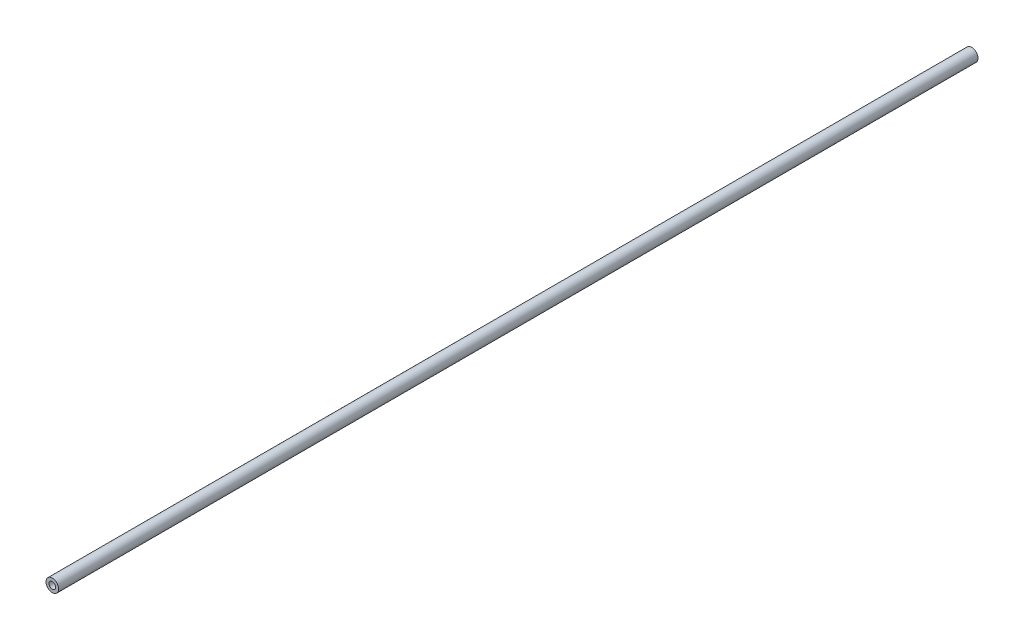
ISO-10303-21;
HEADER;
FILE_DESCRIPTION(('STEP AP214'),'2;1');
FILE_NAME('part.step','',(''),(''),'','','');
FILE_SCHEMA(('AUTOMOTIVE_DESIGN { 1 0 10303 214 1 1 1 1 }'));
ENDSEC;
DATA;
#1=APPLICATION_CONTEXT('core data for automotive mechanical design processes');
#2=APPLICATION_PROTOCOL_DEFINITION('international standard','automotive_design',2000,#1);
#3=PRODUCT_CONTEXT('',#1,'mechanical');
#4=PRODUCT('Part','Part','',(#3));
#5=PRODUCT_RELATED_PRODUCT_CATEGORY('part','',(#4));
#6=PRODUCT_DEFINITION_FORMATION('','',#4);
#7=PRODUCT_DEFINITION_CONTEXT('part definition',#1,'design');
#8=PRODUCT_DEFINITION('design','',#6,#7);
#9=PRODUCT_DEFINITION_SHAPE('','',#8);
#10=(LENGTH_UNIT() NAMED_UNIT(*) SI_UNIT(.MILLI.,.METRE.));
#11=(NAMED_UNIT(*) PLANE_ANGLE_UNIT() SI_UNIT($,.RADIAN.));
#12=(NAMED_UNIT(*) SI_UNIT($,.STERADIAN.) SOLID_ANGLE_UNIT());
#13=UNCERTAINTY_MEASURE_WITH_UNIT(LENGTH_MEASURE(1.E-05),#10,'distance_accuracy_value','');
#14=(GEOMETRIC_REPRESENTATION_CONTEXT(3) GLOBAL_UNCERTAINTY_ASSIGNED_CONTEXT((#13)) GLOBAL_UNIT_ASSIGNED_CONTEXT((#10,
#11,#12)) REPRESENTATION_CONTEXT('',''));
#15=CARTESIAN_POINT('',(0.,0.,0.));
#16=DIRECTION('',(0.,0.,1.));
#17=DIRECTION('',(1.,0.,0.));
#18=AXIS2_PLACEMENT_3D('',#15,#16,#17);
#19=CARTESIAN_POINT('',(0.,0.,692.15));
#20=DIRECTION('',(0.,0.,1.));
#21=DIRECTION('',(1.,0.,0.));
#22=AXIS2_PLACEMENT_3D('',#19,#20,#21);
#23=PLANE('',#22);
#24=CARTESIAN_POINT('',(0.,0.,692.15));
#25=DIRECTION('',(0.,0.,1.));
#26=DIRECTION('',(1.,0.,0.));
#27=AXIS2_PLACEMENT_3D('',#24,#25,#26);
#28=CIRCLE('',#27,4.7625);
#29=CARTESIAN_POINT('',(4.7625,0.,692.15));
#30=VERTEX_POINT('',#29);
#31=EDGE_CURVE('E10',#30,#30,#28,.T.);
#32=ORIENTED_EDGE('',*,*,#31,.T.);
#33=EDGE_LOOP('',(#32));
#34=FACE_BOUND('',#33,.T.);
#35=CARTESIAN_POINT('',(0.,0.,692.15));
#36=DIRECTION('',(0.,0.,1.));
#37=DIRECTION('',(1.,0.,0.));
#38=AXIS2_PLACEMENT_3D('',#35,#36,#37);
#39=CIRCLE('',#38,2.4892);
#40=CARTESIAN_POINT('',(2.4892,0.,692.15));
#41=VERTEX_POINT('',#40);
#42=EDGE_CURVE('E56',#41,#41,#39,.T.);
#43=ORIENTED_EDGE('',*,*,#42,.F.);
#44=EDGE_LOOP('',(#43));
#45=FACE_BOUND('',#44,.T.);
#46=ADVANCED_FACE('F43',(#34,#45),#23,.T.);
#47=CARTESIAN_POINT('',(0.,0.,0.));
#48=DIRECTION('',(0.,0.,1.));
#49=DIRECTION('',(1.,0.,0.));
#50=AXIS2_PLACEMENT_3D('',#47,#48,#49);
#51=PLANE('',#50);
#52=CARTESIAN_POINT('',(0.,0.,0.));
#53=DIRECTION('',(0.,0.,1.));
#54=DIRECTION('',(1.,0.,0.));
#55=AXIS2_PLACEMENT_3D('',#52,#53,#54);
#56=CIRCLE('',#55,4.7625);
#57=CARTESIAN_POINT('',(4.7625,0.,0.));
#58=VERTEX_POINT('',#57);
#59=EDGE_CURVE('E47',#58,#58,#56,.T.);
#60=ORIENTED_EDGE('',*,*,#59,.F.);
#61=EDGE_LOOP('',(#60));
#62=FACE_BOUND('',#61,.T.);
#63=CARTESIAN_POINT('',(0.,0.,0.));
#64=DIRECTION('',(0.,0.,1.));
#65=DIRECTION('',(1.,0.,0.));
#66=AXIS2_PLACEMENT_3D('',#63,#64,#65);
#67=CIRCLE('',#66,2.4892);
#68=CARTESIAN_POINT('',(2.4892,0.,0.));
#69=VERTEX_POINT('',#68);
#70=EDGE_CURVE('E58',#69,#69,#67,.T.);
#71=ORIENTED_EDGE('',*,*,#70,.T.);
#72=EDGE_LOOP('',(#71));
#73=FACE_BOUND('',#72,.T.);
#74=ADVANCED_FACE('F70',(#62,#73),#51,.F.);
#75=CARTESIAN_POINT('',(0.,0.,692.15));
#76=DIRECTION('',(0.,0.,-1.));
#77=DIRECTION('',(-1.,0.,0.));
#78=AXIS2_PLACEMENT_3D('',#75,#76,#77);
#79=CYLINDRICAL_SURFACE('',#78,4.7625);
#80=ORIENTED_EDGE('',*,*,#31,.F.);
#81=EDGE_LOOP('',(#80));
#82=FACE_BOUND('',#81,.T.);
#83=ORIENTED_EDGE('',*,*,#59,.T.);
#84=EDGE_LOOP('',(#83));
#85=FACE_BOUND('',#84,.T.);
#86=ADVANCED_FACE('F45',(#82,#85),#79,.T.);
#87=CARTESIAN_POINT('',(0.,0.,692.15));
#88=DIRECTION('',(0.,0.,-1.));
#89=DIRECTION('',(-1.,0.,0.));
#90=AXIS2_PLACEMENT_3D('',#87,#88,#89);
#91=CYLINDRICAL_SURFACE('',#90,2.4892);
#92=ORIENTED_EDGE('',*,*,#42,.T.);
#93=EDGE_LOOP('',(#92));
#94=FACE_BOUND('',#93,.T.);
#95=ORIENTED_EDGE('',*,*,#70,.F.);
#96=EDGE_LOOP('',(#95));
#97=FACE_BOUND('',#96,.T.);
#98=ADVANCED_FACE('F66',(#94,#97),#91,.F.);
#99=CLOSED_SHELL('',(#46,#74,#86,#98));
#100=MANIFOLD_SOLID_BREP('B2',#99);
#101=ADVANCED_BREP_SHAPE_REPRESENTATION('',(#18,#100),#14);
#102=SHAPE_DEFINITION_REPRESENTATION(#9,#101);
ENDSEC;
END-ISO-10303-21;
